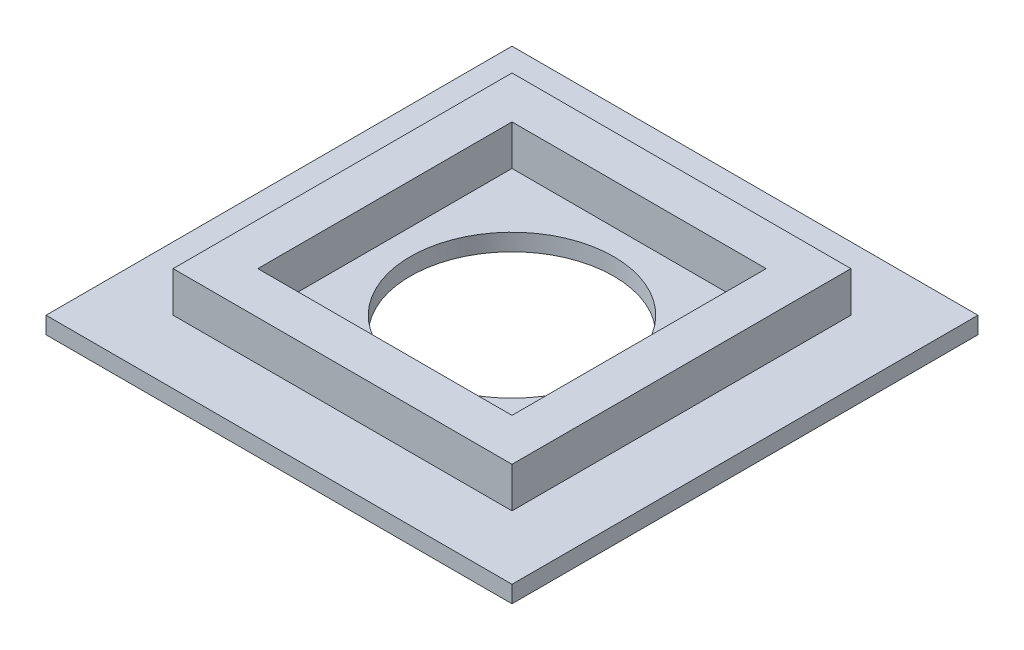
ISO-10303-21;
HEADER;
FILE_DESCRIPTION(('STEP AP214'),'2;1');
FILE_NAME('part.step','',(''),(''),'','','');
FILE_SCHEMA(('AUTOMOTIVE_DESIGN { 1 0 10303 214 1 1 1 1 }'));
ENDSEC;
DATA;
#1=APPLICATION_CONTEXT('core data for automotive mechanical design processes');
#2=APPLICATION_PROTOCOL_DEFINITION('international standard','automotive_design',2000,#1);
#3=PRODUCT_CONTEXT('',#1,'mechanical');
#4=PRODUCT('Part','Part','',(#3));
#5=PRODUCT_RELATED_PRODUCT_CATEGORY('part','',(#4));
#6=PRODUCT_DEFINITION_FORMATION('','',#4);
#7=PRODUCT_DEFINITION_CONTEXT('part definition',#1,'design');
#8=PRODUCT_DEFINITION('design','',#6,#7);
#9=PRODUCT_DEFINITION_SHAPE('','',#8);
#10=(LENGTH_UNIT() NAMED_UNIT(*) SI_UNIT(.MILLI.,.METRE.));
#11=(NAMED_UNIT(*) PLANE_ANGLE_UNIT() SI_UNIT($,.RADIAN.));
#12=(NAMED_UNIT(*) SI_UNIT($,.STERADIAN.) SOLID_ANGLE_UNIT());
#13=UNCERTAINTY_MEASURE_WITH_UNIT(LENGTH_MEASURE(1.E-05),#10,'distance_accuracy_value','');
#14=(GEOMETRIC_REPRESENTATION_CONTEXT(3) GLOBAL_UNCERTAINTY_ASSIGNED_CONTEXT((#13)) GLOBAL_UNIT_ASSIGNED_CONTEXT((#10,
#11,#12)) REPRESENTATION_CONTEXT('',''));
#15=CARTESIAN_POINT('',(0.,0.,0.));
#16=DIRECTION('',(0.,0.,1.));
#17=DIRECTION('',(1.,0.,0.));
#18=AXIS2_PLACEMENT_3D('',#15,#16,#17);
#19=CARTESIAN_POINT('',(0.,0.,0.));
#20=DIRECTION('',(0.,1.,0.));
#21=DIRECTION('',(0.,0.,1.));
#22=AXIS2_PLACEMENT_3D('',#19,#20,#21);
#23=PLANE('',#22);
#24=DIRECTION('',(0.,0.,1.));
#25=VECTOR('',#24,1.);
#26=CARTESIAN_POINT('',(-55.,0.,55.));
#27=LINE('',#26,#25);
#28=CARTESIAN_POINT('',(-55.,0.,-55.));
#29=VERTEX_POINT('',#28);
#30=CARTESIAN_POINT('',(-55.,0.,55.));
#31=VERTEX_POINT('',#30);
#32=EDGE_CURVE('E193',#29,#31,#27,.T.);
#33=ORIENTED_EDGE('',*,*,#32,.T.);
#34=DIRECTION('',(1.,0.,0.));
#35=VECTOR('',#34,1.);
#36=CARTESIAN_POINT('',(55.,0.,55.));
#37=LINE('',#36,#35);
#38=CARTESIAN_POINT('',(55.,0.,55.));
#39=VERTEX_POINT('',#38);
#40=EDGE_CURVE('E209',#31,#39,#37,.T.);
#41=ORIENTED_EDGE('',*,*,#40,.T.);
#42=DIRECTION('',(0.,0.,-1.));
#43=VECTOR('',#42,1.);
#44=CARTESIAN_POINT('',(55.,0.,55.));
#45=LINE('',#44,#43);
#46=CARTESIAN_POINT('',(55.,0.,-55.));
#47=VERTEX_POINT('',#46);
#48=EDGE_CURVE('E212',#39,#47,#45,.T.);
#49=ORIENTED_EDGE('',*,*,#48,.T.);
#50=DIRECTION('',(-1.,0.,0.));
#51=VECTOR('',#50,1.);
#52=CARTESIAN_POINT('',(55.,0.,-55.));
#53=LINE('',#52,#51);
#54=EDGE_CURVE('E198',#47,#29,#53,.T.);
#55=ORIENTED_EDGE('',*,*,#54,.T.);
#56=EDGE_LOOP('',(#33,#41,#49,#55));
#57=FACE_BOUND('',#56,.T.);
#58=DIRECTION('',(1.,0.,0.));
#59=VECTOR('',#58,1.);
#60=CARTESIAN_POINT('',(40.,0.,40.));
#61=LINE('',#60,#59);
#62=CARTESIAN_POINT('',(-40.,0.,40.));
#63=VERTEX_POINT('',#62);
#64=CARTESIAN_POINT('',(40.,0.,40.));
#65=VERTEX_POINT('',#64);
#66=EDGE_CURVE('E180',#63,#65,#61,.T.);
#67=ORIENTED_EDGE('',*,*,#66,.F.);
#68=DIRECTION('',(0.,0.,1.));
#69=VECTOR('',#68,1.);
#70=CARTESIAN_POINT('',(-40.,0.,-40.));
#71=LINE('',#70,#69);
#72=CARTESIAN_POINT('',(-40.,0.,-40.));
#73=VERTEX_POINT('',#72);
#74=EDGE_CURVE('E143',#73,#63,#71,.T.);
#75=ORIENTED_EDGE('',*,*,#74,.F.);
#76=DIRECTION('',(-1.,0.,0.));
#77=VECTOR('',#76,1.);
#78=CARTESIAN_POINT('',(40.,0.,-40.));
#79=LINE('',#78,#77);
#80=CARTESIAN_POINT('',(40.,0.,-40.));
#81=VERTEX_POINT('',#80);
#82=EDGE_CURVE('E171',#81,#73,#79,.T.);
#83=ORIENTED_EDGE('',*,*,#82,.F.);
#84=DIRECTION('',(0.,0.,-1.));
#85=VECTOR('',#84,1.);
#86=CARTESIAN_POINT('',(40.,0.,-40.));
#87=LINE('',#86,#85);
#88=EDGE_CURVE('E182',#65,#81,#87,.T.);
#89=ORIENTED_EDGE('',*,*,#88,.F.);
#90=EDGE_LOOP('',(#67,#75,#83,#89));
#91=FACE_BOUND('',#90,.T.);
#92=ADVANCED_FACE('F34',(#57,#91),#23,.T.);
#93=CARTESIAN_POINT('',(-55.,-4.,55.));
#94=DIRECTION('',(-1.,0.,0.));
#95=DIRECTION('',(0.,0.,1.));
#96=AXIS2_PLACEMENT_3D('',#93,#94,#95);
#97=PLANE('',#96);
#98=ORIENTED_EDGE('',*,*,#32,.F.);
#99=DIRECTION('',(0.,1.,0.));
#100=VECTOR('',#99,1.);
#101=CARTESIAN_POINT('',(-55.,-4.,-55.));
#102=LINE('',#101,#100);
#103=CARTESIAN_POINT('',(-55.,-4.,-55.));
#104=VERTEX_POINT('',#103);
#105=EDGE_CURVE('E11',#104,#29,#102,.T.);
#106=ORIENTED_EDGE('',*,*,#105,.F.);
#107=DIRECTION('',(0.,0.,1.));
#108=VECTOR('',#107,1.);
#109=CARTESIAN_POINT('',(-55.,-4.,55.));
#110=LINE('',#109,#108);
#111=CARTESIAN_POINT('',(-55.,-4.,55.));
#112=VERTEX_POINT('',#111);
#113=EDGE_CURVE('E194',#104,#112,#110,.T.);
#114=ORIENTED_EDGE('',*,*,#113,.T.);
#115=DIRECTION('',(0.,1.,0.));
#116=VECTOR('',#115,1.);
#117=CARTESIAN_POINT('',(-55.,-4.,55.));
#118=LINE('',#117,#116);
#119=EDGE_CURVE('E38',#112,#31,#118,.T.);
#120=ORIENTED_EDGE('',*,*,#119,.T.);
#121=EDGE_LOOP('',(#98,#106,#114,#120));
#122=FACE_BOUND('',#121,.T.);
#123=ADVANCED_FACE('F36',(#122),#97,.T.);
#124=CARTESIAN_POINT('',(55.,-4.,-55.));
#125=DIRECTION('',(0.,0.,-1.));
#126=DIRECTION('',(-1.,0.,0.));
#127=AXIS2_PLACEMENT_3D('',#124,#125,#126);
#128=PLANE('',#127);
#129=ORIENTED_EDGE('',*,*,#54,.F.);
#130=DIRECTION('',(0.,1.,0.));
#131=VECTOR('',#130,1.);
#132=CARTESIAN_POINT('',(55.,-4.,-55.));
#133=LINE('',#132,#131);
#134=CARTESIAN_POINT('',(55.,-4.,-55.));
#135=VERTEX_POINT('',#134);
#136=EDGE_CURVE('E43',#135,#47,#133,.T.);
#137=ORIENTED_EDGE('',*,*,#136,.F.);
#138=DIRECTION('',(-1.,0.,0.));
#139=VECTOR('',#138,1.);
#140=CARTESIAN_POINT('',(55.,-4.,-55.));
#141=LINE('',#140,#139);
#142=EDGE_CURVE('E204',#135,#104,#141,.T.);
#143=ORIENTED_EDGE('',*,*,#142,.T.);
#144=ORIENTED_EDGE('',*,*,#105,.T.);
#145=EDGE_LOOP('',(#129,#137,#143,#144));
#146=FACE_BOUND('',#145,.T.);
#147=ADVANCED_FACE('F230',(#146),#128,.T.);
#148=CARTESIAN_POINT('',(55.,-4.,55.));
#149=DIRECTION('',(1.,0.,0.));
#150=DIRECTION('',(0.,0.,-1.));
#151=AXIS2_PLACEMENT_3D('',#148,#149,#150);
#152=PLANE('',#151);
#153=ORIENTED_EDGE('',*,*,#48,.F.);
#154=DIRECTION('',(0.,1.,0.));
#155=VECTOR('',#154,1.);
#156=CARTESIAN_POINT('',(55.,-4.,55.));
#157=LINE('',#156,#155);
#158=CARTESIAN_POINT('',(55.,-4.,55.));
#159=VERTEX_POINT('',#158);
#160=EDGE_CURVE('E217',#159,#39,#157,.T.);
#161=ORIENTED_EDGE('',*,*,#160,.F.);
#162=DIRECTION('',(0.,0.,-1.));
#163=VECTOR('',#162,1.);
#164=CARTESIAN_POINT('',(55.,-4.,55.));
#165=LINE('',#164,#163);
#166=EDGE_CURVE('E201',#159,#135,#165,.T.);
#167=ORIENTED_EDGE('',*,*,#166,.T.);
#168=ORIENTED_EDGE('',*,*,#136,.T.);
#169=EDGE_LOOP('',(#153,#161,#167,#168));
#170=FACE_BOUND('',#169,.T.);
#171=ADVANCED_FACE('F236',(#170),#152,.T.);
#172=CARTESIAN_POINT('',(55.,-4.,55.));
#173=DIRECTION('',(0.,0.,1.));
#174=DIRECTION('',(1.,0.,0.));
#175=AXIS2_PLACEMENT_3D('',#172,#173,#174);
#176=PLANE('',#175);
#177=ORIENTED_EDGE('',*,*,#40,.F.);
#178=ORIENTED_EDGE('',*,*,#119,.F.);
#179=DIRECTION('',(1.,0.,0.));
#180=VECTOR('',#179,1.);
#181=CARTESIAN_POINT('',(55.,-4.,55.));
#182=LINE('',#181,#180);
#183=EDGE_CURVE('E197',#112,#159,#182,.T.);
#184=ORIENTED_EDGE('',*,*,#183,.T.);
#185=ORIENTED_EDGE('',*,*,#160,.T.);
#186=EDGE_LOOP('',(#177,#178,#184,#185));
#187=FACE_BOUND('',#186,.T.);
#188=ADVANCED_FACE('F225',(#187),#176,.T.);
#189=CARTESIAN_POINT('',(0.,-4.,0.));
#190=DIRECTION('',(0.,1.,0.));
#191=DIRECTION('',(0.,0.,1.));
#192=AXIS2_PLACEMENT_3D('',#189,#190,#191);
#193=PLANE('',#192);
#194=CARTESIAN_POINT('',(0.,-4.,0.));
#195=DIRECTION('',(0.,1.,0.));
#196=DIRECTION('',(0.,0.,1.));
#197=AXIS2_PLACEMENT_3D('',#194,#195,#196);
#198=CIRCLE('',#197,24.000000006);
#199=CARTESIAN_POINT('',(0.,-4.,24.000000006));
#200=VERTEX_POINT('',#199);
#201=EDGE_CURVE('E157',#200,#200,#198,.T.);
#202=ORIENTED_EDGE('',*,*,#201,.T.);
#203=EDGE_LOOP('',(#202));
#204=FACE_BOUND('',#203,.T.);
#205=ORIENTED_EDGE('',*,*,#113,.F.);
#206=ORIENTED_EDGE('',*,*,#142,.F.);
#207=ORIENTED_EDGE('',*,*,#166,.F.);
#208=ORIENTED_EDGE('',*,*,#183,.F.);
#209=EDGE_LOOP('',(#205,#206,#207,#208));
#210=FACE_BOUND('',#209,.T.);
#211=ADVANCED_FACE('F233',(#204,#210),#193,.F.);
#212=CARTESIAN_POINT('',(0.,9.525,0.));
#213=DIRECTION('',(0.,-1.,0.));
#214=DIRECTION('',(0.,0.,-1.));
#215=AXIS2_PLACEMENT_3D('',#212,#213,#214);
#216=PLANE('',#215);
#217=DIRECTION('',(0.,0.,1.));
#218=VECTOR('',#217,1.);
#219=CARTESIAN_POINT('',(-40.,9.525,-40.));
#220=LINE('',#219,#218);
#221=CARTESIAN_POINT('',(-40.,9.525,-40.));
#222=VERTEX_POINT('',#221);
#223=CARTESIAN_POINT('',(-40.,9.525,40.));
#224=VERTEX_POINT('',#223);
#225=EDGE_CURVE('E167',#222,#224,#220,.T.);
#226=ORIENTED_EDGE('',*,*,#225,.T.);
#227=DIRECTION('',(1.,0.,0.));
#228=VECTOR('',#227,1.);
#229=CARTESIAN_POINT('',(40.,9.525,40.));
#230=LINE('',#229,#228);
#231=CARTESIAN_POINT('',(40.,9.525,40.));
#232=VERTEX_POINT('',#231);
#233=EDGE_CURVE('E170',#224,#232,#230,.T.);
#234=ORIENTED_EDGE('',*,*,#233,.T.);
#235=DIRECTION('',(0.,0.,-1.));
#236=VECTOR('',#235,1.);
#237=CARTESIAN_POINT('',(40.,9.525,-40.));
#238=LINE('',#237,#236);
#239=CARTESIAN_POINT('',(40.,9.525,-40.));
#240=VERTEX_POINT('',#239);
#241=EDGE_CURVE('E173',#232,#240,#238,.T.);
#242=ORIENTED_EDGE('',*,*,#241,.T.);
#243=DIRECTION('',(-1.,0.,0.));
#244=VECTOR('',#243,1.);
#245=CARTESIAN_POINT('',(40.,9.525,-40.));
#246=LINE('',#245,#244);
#247=EDGE_CURVE('E175',#240,#222,#246,.T.);
#248=ORIENTED_EDGE('',*,*,#247,.T.);
#249=EDGE_LOOP('',(#226,#234,#242,#248));
#250=FACE_BOUND('',#249,.T.);
#251=DIRECTION('',(0.,0.,1.));
#252=VECTOR('',#251,1.);
#253=CARTESIAN_POINT('',(-30.,9.525,-30.));
#254=LINE('',#253,#252);
#255=CARTESIAN_POINT('',(-30.,9.525,-30.));
#256=VERTEX_POINT('',#255);
#257=CARTESIAN_POINT('',(-30.,9.525,30.));
#258=VERTEX_POINT('',#257);
#259=EDGE_CURVE('E126',#256,#258,#254,.T.);
#260=ORIENTED_EDGE('',*,*,#259,.F.);
#261=DIRECTION('',(-1.,0.,0.));
#262=VECTOR('',#261,1.);
#263=CARTESIAN_POINT('',(30.,9.525,-30.));
#264=LINE('',#263,#262);
#265=CARTESIAN_POINT('',(30.,9.525,-30.));
#266=VERTEX_POINT('',#265);
#267=EDGE_CURVE('E151',#266,#256,#264,.T.);
#268=ORIENTED_EDGE('',*,*,#267,.F.);
#269=DIRECTION('',(0.,0.,-1.));
#270=VECTOR('',#269,1.);
#271=CARTESIAN_POINT('',(30.,9.525,-30.));
#272=LINE('',#271,#270);
#273=CARTESIAN_POINT('',(30.,9.525,30.));
#274=VERTEX_POINT('',#273);
#275=EDGE_CURVE('E149',#274,#266,#272,.T.);
#276=ORIENTED_EDGE('',*,*,#275,.F.);
#277=DIRECTION('',(1.,0.,0.));
#278=VECTOR('',#277,1.);
#279=CARTESIAN_POINT('',(30.,9.525,30.));
#280=LINE('',#279,#278);
#281=EDGE_CURVE('E135',#258,#274,#280,.T.);
#282=ORIENTED_EDGE('',*,*,#281,.F.);
#283=EDGE_LOOP('',(#260,#268,#276,#282));
#284=FACE_BOUND('',#283,.T.);
#285=ADVANCED_FACE('F147',(#250,#284),#216,.F.);
#286=CARTESIAN_POINT('',(-40.,9.525,-40.));
#287=DIRECTION('',(1.,0.,0.));
#288=DIRECTION('',(0.,0.,-1.));
#289=AXIS2_PLACEMENT_3D('',#286,#287,#288);
#290=PLANE('',#289);
#291=ORIENTED_EDGE('',*,*,#74,.T.);
#292=DIRECTION('',(0.,-1.,0.));
#293=VECTOR('',#292,1.);
#294=CARTESIAN_POINT('',(-40.,9.525,40.));
#295=LINE('',#294,#293);
#296=EDGE_CURVE('E191',#224,#63,#295,.T.);
#297=ORIENTED_EDGE('',*,*,#296,.F.);
#298=ORIENTED_EDGE('',*,*,#225,.F.);
#299=DIRECTION('',(0.,-1.,0.));
#300=VECTOR('',#299,1.);
#301=CARTESIAN_POINT('',(-40.,9.525,-40.));
#302=LINE('',#301,#300);
#303=EDGE_CURVE('E177',#222,#73,#302,.T.);
#304=ORIENTED_EDGE('',*,*,#303,.T.);
#305=EDGE_LOOP('',(#291,#297,#298,#304));
#306=FACE_BOUND('',#305,.T.);
#307=ADVANCED_FACE('F276',(#306),#290,.F.);
#308=CARTESIAN_POINT('',(40.,9.525,40.));
#309=DIRECTION('',(0.,0.,-1.));
#310=DIRECTION('',(-1.,0.,0.));
#311=AXIS2_PLACEMENT_3D('',#308,#309,#310);
#312=PLANE('',#311);
#313=ORIENTED_EDGE('',*,*,#66,.T.);
#314=DIRECTION('',(0.,-1.,0.));
#315=VECTOR('',#314,1.);
#316=CARTESIAN_POINT('',(40.,9.525,40.));
#317=LINE('',#316,#315);
#318=EDGE_CURVE('E188',#232,#65,#317,.T.);
#319=ORIENTED_EDGE('',*,*,#318,.F.);
#320=ORIENTED_EDGE('',*,*,#233,.F.);
#321=ORIENTED_EDGE('',*,*,#296,.T.);
#322=EDGE_LOOP('',(#313,#319,#320,#321));
#323=FACE_BOUND('',#322,.T.);
#324=ADVANCED_FACE('F282',(#323),#312,.F.);
#325=CARTESIAN_POINT('',(40.,9.525,-40.));
#326=DIRECTION('',(-1.,0.,0.));
#327=DIRECTION('',(0.,0.,1.));
#328=AXIS2_PLACEMENT_3D('',#325,#326,#327);
#329=PLANE('',#328);
#330=ORIENTED_EDGE('',*,*,#88,.T.);
#331=DIRECTION('',(0.,-1.,0.));
#332=VECTOR('',#331,1.);
#333=CARTESIAN_POINT('',(40.,9.525,-40.));
#334=LINE('',#333,#332);
#335=EDGE_CURVE('E51',#240,#81,#334,.T.);
#336=ORIENTED_EDGE('',*,*,#335,.F.);
#337=ORIENTED_EDGE('',*,*,#241,.F.);
#338=ORIENTED_EDGE('',*,*,#318,.T.);
#339=EDGE_LOOP('',(#330,#336,#337,#338));
#340=FACE_BOUND('',#339,.T.);
#341=ADVANCED_FACE('F286',(#340),#329,.F.);
#342=CARTESIAN_POINT('',(40.,9.525,-40.));
#343=DIRECTION('',(0.,0.,1.));
#344=DIRECTION('',(1.,0.,0.));
#345=AXIS2_PLACEMENT_3D('',#342,#343,#344);
#346=PLANE('',#345);
#347=ORIENTED_EDGE('',*,*,#82,.T.);
#348=ORIENTED_EDGE('',*,*,#303,.F.);
#349=ORIENTED_EDGE('',*,*,#247,.F.);
#350=ORIENTED_EDGE('',*,*,#335,.T.);
#351=EDGE_LOOP('',(#347,#348,#349,#350));
#352=FACE_BOUND('',#351,.T.);
#353=ADVANCED_FACE('F290',(#352),#346,.F.);
#354=CARTESIAN_POINT('',(-30.,9.525,-30.));
#355=DIRECTION('',(1.,0.,0.));
#356=DIRECTION('',(0.,0.,-1.));
#357=AXIS2_PLACEMENT_3D('',#354,#355,#356);
#358=PLANE('',#357);
#359=DIRECTION('',(0.,0.,1.));
#360=VECTOR('',#359,1.);
#361=CARTESIAN_POINT('',(-30.,0.,-30.));
#362=LINE('',#361,#360);
#363=CARTESIAN_POINT('',(-30.,0.,-30.));
#364=VERTEX_POINT('',#363);
#365=CARTESIAN_POINT('',(-30.,0.,30.));
#366=VERTEX_POINT('',#365);
#367=EDGE_CURVE('E59',#364,#366,#362,.T.);
#368=ORIENTED_EDGE('',*,*,#367,.F.);
#369=DIRECTION('',(0.,-1.,0.));
#370=VECTOR('',#369,1.);
#371=CARTESIAN_POINT('',(-30.,9.525,-30.));
#372=LINE('',#371,#370);
#373=EDGE_CURVE('E131',#256,#364,#372,.T.);
#374=ORIENTED_EDGE('',*,*,#373,.F.);
#375=ORIENTED_EDGE('',*,*,#259,.T.);
#376=DIRECTION('',(0.,-1.,0.));
#377=VECTOR('',#376,1.);
#378=CARTESIAN_POINT('',(-30.,9.525,30.));
#379=LINE('',#378,#377);
#380=EDGE_CURVE('E129',#258,#366,#379,.T.);
#381=ORIENTED_EDGE('',*,*,#380,.T.);
#382=EDGE_LOOP('',(#368,#374,#375,#381));
#383=FACE_BOUND('',#382,.T.);
#384=ADVANCED_FACE('F128',(#383),#358,.T.);
#385=CARTESIAN_POINT('',(30.,9.525,30.));
#386=DIRECTION('',(0.,0.,-1.));
#387=DIRECTION('',(-1.,0.,0.));
#388=AXIS2_PLACEMENT_3D('',#385,#386,#387);
#389=PLANE('',#388);
#390=DIRECTION('',(1.,0.,0.));
#391=VECTOR('',#390,1.);
#392=CARTESIAN_POINT('',(30.,0.,30.));
#393=LINE('',#392,#391);
#394=CARTESIAN_POINT('',(30.,0.,30.));
#395=VERTEX_POINT('',#394);
#396=EDGE_CURVE('E142',#366,#395,#393,.T.);
#397=ORIENTED_EDGE('',*,*,#396,.F.);
#398=ORIENTED_EDGE('',*,*,#380,.F.);
#399=ORIENTED_EDGE('',*,*,#281,.T.);
#400=DIRECTION('',(0.,-1.,0.));
#401=VECTOR('',#400,1.);
#402=CARTESIAN_POINT('',(30.,9.525,30.));
#403=LINE('',#402,#401);
#404=EDGE_CURVE('E144',#274,#395,#403,.T.);
#405=ORIENTED_EDGE('',*,*,#404,.T.);
#406=EDGE_LOOP('',(#397,#398,#399,#405));
#407=FACE_BOUND('',#406,.T.);
#408=ADVANCED_FACE('F139',(#407),#389,.T.);
#409=CARTESIAN_POINT('',(30.,9.525,-30.));
#410=DIRECTION('',(-1.,0.,0.));
#411=DIRECTION('',(0.,0.,1.));
#412=AXIS2_PLACEMENT_3D('',#409,#410,#411);
#413=PLANE('',#412);
#414=DIRECTION('',(0.,0.,-1.));
#415=VECTOR('',#414,1.);
#416=CARTESIAN_POINT('',(30.,0.,-30.));
#417=LINE('',#416,#415);
#418=CARTESIAN_POINT('',(30.,0.,-30.));
#419=VERTEX_POINT('',#418);
#420=EDGE_CURVE('E159',#395,#419,#417,.T.);
#421=ORIENTED_EDGE('',*,*,#420,.F.);
#422=ORIENTED_EDGE('',*,*,#404,.F.);
#423=ORIENTED_EDGE('',*,*,#275,.T.);
#424=DIRECTION('',(0.,-1.,0.));
#425=VECTOR('',#424,1.);
#426=CARTESIAN_POINT('',(30.,9.525,-30.));
#427=LINE('',#426,#425);
#428=EDGE_CURVE('E163',#266,#419,#427,.T.);
#429=ORIENTED_EDGE('',*,*,#428,.T.);
#430=EDGE_LOOP('',(#421,#422,#423,#429));
#431=FACE_BOUND('',#430,.T.);
#432=ADVANCED_FACE('F261',(#431),#413,.T.);
#433=CARTESIAN_POINT('',(30.,9.525,-30.));
#434=DIRECTION('',(0.,0.,1.));
#435=DIRECTION('',(1.,0.,0.));
#436=AXIS2_PLACEMENT_3D('',#433,#434,#435);
#437=PLANE('',#436);
#438=DIRECTION('',(-1.,0.,0.));
#439=VECTOR('',#438,1.);
#440=CARTESIAN_POINT('',(30.,0.,-30.));
#441=LINE('',#440,#439);
#442=EDGE_CURVE('E136',#419,#364,#441,.T.);
#443=ORIENTED_EDGE('',*,*,#442,.F.);
#444=ORIENTED_EDGE('',*,*,#428,.F.);
#445=ORIENTED_EDGE('',*,*,#267,.T.);
#446=ORIENTED_EDGE('',*,*,#373,.T.);
#447=EDGE_LOOP('',(#443,#444,#445,#446));
#448=FACE_BOUND('',#447,.T.);
#449=ADVANCED_FACE('F253',(#448),#437,.T.);
#450=CARTESIAN_POINT('',(0.,0.,0.));
#451=DIRECTION('',(0.,1.,0.));
#452=DIRECTION('',(0.,0.,1.));
#453=AXIS2_PLACEMENT_3D('',#450,#451,#452);
#454=CIRCLE('',#453,24.000000006);
#455=CARTESIAN_POINT('',(0.,0.,24.000000006));
#456=VERTEX_POINT('',#455);
#457=EDGE_CURVE('E266',#456,#456,#454,.T.);
#458=ORIENTED_EDGE('',*,*,#457,.F.);
#459=EDGE_LOOP('',(#458));
#460=FACE_BOUND('',#459,.T.);
#461=ORIENTED_EDGE('',*,*,#367,.T.);
#462=ORIENTED_EDGE('',*,*,#396,.T.);
#463=ORIENTED_EDGE('',*,*,#420,.T.);
#464=ORIENTED_EDGE('',*,*,#442,.T.);
#465=EDGE_LOOP('',(#461,#462,#463,#464));
#466=FACE_BOUND('',#465,.T.);
#467=ADVANCED_FACE('F246',(#460,#466),#23,.T.);
#468=CARTESIAN_POINT('',(0.,-20.,0.));
#469=DIRECTION('',(0.,1.,0.));
#470=DIRECTION('',(0.,0.,1.));
#471=AXIS2_PLACEMENT_3D('',#468,#469,#470);
#472=CYLINDRICAL_SURFACE('',#471,24.000000006);
#473=ORIENTED_EDGE('',*,*,#457,.T.);
#474=EDGE_LOOP('',(#473));
#475=FACE_BOUND('',#474,.T.);
#476=ORIENTED_EDGE('',*,*,#201,.F.);
#477=EDGE_LOOP('',(#476));
#478=FACE_BOUND('',#477,.T.);
#479=ADVANCED_FACE('F252',(#475,#478),#472,.F.);
#480=CLOSED_SHELL('',(#92,#123,#147,#171,#188,#211,#285,#307,#324,#341,#353,#384,#408,#432,#449,
#467,#479));
#481=MANIFOLD_SOLID_BREP('B2',#480);
#482=ADVANCED_BREP_SHAPE_REPRESENTATION('',(#18,#481),#14);
#483=SHAPE_DEFINITION_REPRESENTATION(#9,#482);
ENDSEC;
END-ISO-10303-21;
